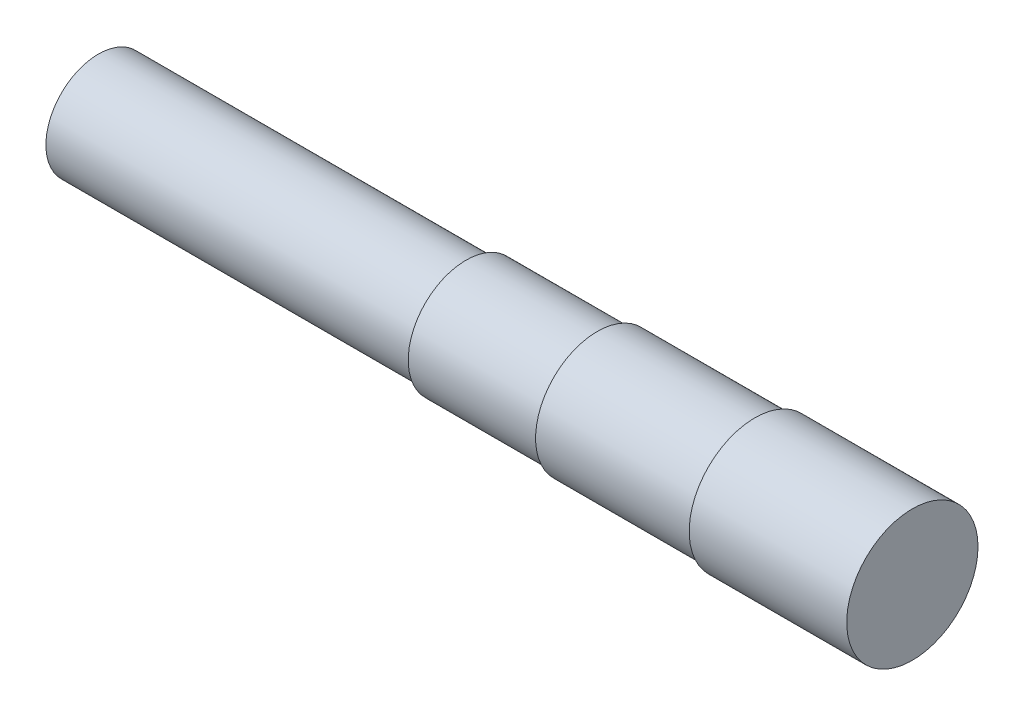
ISO-10303-21;
HEADER;
FILE_DESCRIPTION(('STEP AP214'),'2;1');
FILE_NAME('part.step','',(''),(''),'','','');
FILE_SCHEMA(('AUTOMOTIVE_DESIGN { 1 0 10303 214 1 1 1 1 }'));
ENDSEC;
DATA;
#1=APPLICATION_CONTEXT('core data for automotive mechanical design processes');
#2=APPLICATION_PROTOCOL_DEFINITION('international standard','automotive_design',2000,#1);
#3=PRODUCT_CONTEXT('',#1,'mechanical');
#4=PRODUCT('Part','Part','',(#3));
#5=PRODUCT_RELATED_PRODUCT_CATEGORY('part','',(#4));
#6=PRODUCT_DEFINITION_FORMATION('','',#4);
#7=PRODUCT_DEFINITION_CONTEXT('part definition',#1,'design');
#8=PRODUCT_DEFINITION('design','',#6,#7);
#9=PRODUCT_DEFINITION_SHAPE('','',#8);
#10=(LENGTH_UNIT() NAMED_UNIT(*) SI_UNIT(.MILLI.,.METRE.));
#11=(NAMED_UNIT(*) PLANE_ANGLE_UNIT() SI_UNIT($,.RADIAN.));
#12=(NAMED_UNIT(*) SI_UNIT($,.STERADIAN.) SOLID_ANGLE_UNIT());
#13=UNCERTAINTY_MEASURE_WITH_UNIT(LENGTH_MEASURE(1.E-05),#10,'distance_accuracy_value','');
#14=(GEOMETRIC_REPRESENTATION_CONTEXT(3) GLOBAL_UNCERTAINTY_ASSIGNED_CONTEXT((#13)) GLOBAL_UNIT_ASSIGNED_CONTEXT((#10,
#11,#12)) REPRESENTATION_CONTEXT('',''));
#15=CARTESIAN_POINT('',(0.,0.,0.));
#16=DIRECTION('',(0.,0.,1.));
#17=DIRECTION('',(1.,0.,0.));
#18=AXIS2_PLACEMENT_3D('',#15,#16,#17);
#19=CARTESIAN_POINT('',(0.,0.,0.));
#20=DIRECTION('',(1.,0.,0.));
#21=DIRECTION('',(0.,0.,-1.));
#22=AXIS2_PLACEMENT_3D('',#19,#20,#21);
#23=PLANE('',#22);
#24=CARTESIAN_POINT('',(0.,0.,0.));
#25=DIRECTION('',(1.,0.,0.));
#26=DIRECTION('',(0.,0.,-1.));
#27=AXIS2_PLACEMENT_3D('',#24,#25,#26);
#28=CIRCLE('',#27,12.5);
#29=CARTESIAN_POINT('',(0.,0.,-12.5));
#30=VERTEX_POINT('',#29);
#31=EDGE_CURVE('E78',#30,#30,#28,.T.);
#32=ORIENTED_EDGE('',*,*,#31,.F.);
#33=EDGE_LOOP('',(#32));
#34=FACE_BOUND('',#33,.T.);
#35=CARTESIAN_POINT('',(0.,0.,0.));
#36=DIRECTION('',(1.,0.,0.));
#37=DIRECTION('',(0.,0.,-1.));
#38=AXIS2_PLACEMENT_3D('',#35,#36,#37);
#39=CIRCLE('',#38,11.75);
#40=CARTESIAN_POINT('',(0.,0.,-11.75));
#41=VERTEX_POINT('',#40);
#42=EDGE_CURVE('E10',#41,#41,#39,.T.);
#43=ORIENTED_EDGE('',*,*,#42,.T.);
#44=EDGE_LOOP('',(#43));
#45=FACE_BOUND('',#44,.T.);
#46=ADVANCED_FACE('F43',(#34,#45),#23,.F.);
#47=CARTESIAN_POINT('',(0.,0.,0.));
#48=DIRECTION('',(1.,0.,0.));
#49=DIRECTION('',(0.,0.,-1.));
#50=AXIS2_PLACEMENT_3D('',#47,#48,#49);
#51=CYLINDRICAL_SURFACE('',#50,11.75);
#52=CARTESIAN_POINT('',(-30.,0.,0.));
#53=DIRECTION('',(1.,0.,0.));
#54=DIRECTION('',(0.,0.,-1.));
#55=AXIS2_PLACEMENT_3D('',#52,#53,#54);
#56=CIRCLE('',#55,11.75);
#57=CARTESIAN_POINT('',(-30.,0.,-11.75));
#58=VERTEX_POINT('',#57);
#59=EDGE_CURVE('E50',#58,#58,#56,.T.);
#60=ORIENTED_EDGE('',*,*,#59,.T.);
#61=EDGE_LOOP('',(#60));
#62=FACE_BOUND('',#61,.T.);
#63=ORIENTED_EDGE('',*,*,#42,.F.);
#64=EDGE_LOOP('',(#63));
#65=FACE_BOUND('',#64,.T.);
#66=ADVANCED_FACE('F86',(#62,#65),#51,.T.);
#67=CARTESIAN_POINT('',(-30.,-1.38777878078144E-13,0.));
#68=DIRECTION('',(1.,0.,0.));
#69=DIRECTION('',(0.,0.,-1.));
#70=AXIS2_PLACEMENT_3D('',#67,#68,#69);
#71=PLANE('',#70);
#72=ORIENTED_EDGE('',*,*,#59,.F.);
#73=EDGE_LOOP('',(#72));
#74=FACE_BOUND('',#73,.T.);
#75=CARTESIAN_POINT('',(-30.,0.,0.));
#76=DIRECTION('',(1.,0.,0.));
#77=DIRECTION('',(0.,0.,-1.));
#78=AXIS2_PLACEMENT_3D('',#75,#76,#77);
#79=CIRCLE('',#78,11.);
#80=CARTESIAN_POINT('',(-30.,0.,-11.));
#81=VERTEX_POINT('',#80);
#82=EDGE_CURVE('E55',#81,#81,#79,.T.);
#83=ORIENTED_EDGE('',*,*,#82,.T.);
#84=EDGE_LOOP('',(#83));
#85=FACE_BOUND('',#84,.T.);
#86=ADVANCED_FACE('F90',(#74,#85),#71,.F.);
#87=CARTESIAN_POINT('',(0.,0.,0.));
#88=DIRECTION('',(1.,0.,0.));
#89=DIRECTION('',(0.,0.,-1.));
#90=AXIS2_PLACEMENT_3D('',#87,#88,#89);
#91=CYLINDRICAL_SURFACE('',#90,11.);
#92=CARTESIAN_POINT('',(-55.,0.,0.));
#93=DIRECTION('',(1.,0.,0.));
#94=DIRECTION('',(0.,0.,-1.));
#95=AXIS2_PLACEMENT_3D('',#92,#93,#94);
#96=CIRCLE('',#95,11.);
#97=CARTESIAN_POINT('',(-55.,0.,-11.));
#98=VERTEX_POINT('',#97);
#99=EDGE_CURVE('E60',#98,#98,#96,.T.);
#100=ORIENTED_EDGE('',*,*,#99,.T.);
#101=EDGE_LOOP('',(#100));
#102=FACE_BOUND('',#101,.T.);
#103=ORIENTED_EDGE('',*,*,#82,.F.);
#104=EDGE_LOOP('',(#103));
#105=FACE_BOUND('',#104,.T.);
#106=ADVANCED_FACE('F94',(#102,#105),#91,.T.);
#107=CARTESIAN_POINT('',(-55.,0.,0.));
#108=DIRECTION('',(-1.,0.,0.));
#109=DIRECTION('',(0.,0.,1.));
#110=AXIS2_PLACEMENT_3D('',#107,#108,#109);
#111=PLANE('',#110);
#112=CARTESIAN_POINT('',(-55.,0.,0.));
#113=DIRECTION('',(1.,0.,0.));
#114=DIRECTION('',(0.,0.,-1.));
#115=AXIS2_PLACEMENT_3D('',#112,#113,#114);
#116=CIRCLE('',#115,9.99999999999999);
#117=CARTESIAN_POINT('',(-55.,0.,-9.99999999999999));
#118=VERTEX_POINT('',#117);
#119=EDGE_CURVE('E66',#118,#118,#116,.T.);
#120=ORIENTED_EDGE('',*,*,#119,.T.);
#121=EDGE_LOOP('',(#120));
#122=FACE_BOUND('',#121,.T.);
#123=ORIENTED_EDGE('',*,*,#99,.F.);
#124=EDGE_LOOP('',(#123));
#125=FACE_BOUND('',#124,.T.);
#126=ADVANCED_FACE('F101',(#122,#125),#111,.T.);
#127=CARTESIAN_POINT('',(0.,0.,0.));
#128=DIRECTION('',(1.,0.,0.));
#129=DIRECTION('',(0.,0.,-1.));
#130=AXIS2_PLACEMENT_3D('',#127,#128,#129);
#131=CYLINDRICAL_SURFACE('',#130,9.99999999999999);
#132=CARTESIAN_POINT('',(-125.,0.,0.));
#133=DIRECTION('',(1.,0.,0.));
#134=DIRECTION('',(0.,0.,-1.));
#135=AXIS2_PLACEMENT_3D('',#132,#133,#134);
#136=CIRCLE('',#135,9.99999999999998);
#137=CARTESIAN_POINT('',(-125.,0.,-9.99999999999998));
#138=VERTEX_POINT('',#137);
#139=EDGE_CURVE('E70',#138,#138,#136,.T.);
#140=ORIENTED_EDGE('',*,*,#139,.T.);
#141=EDGE_LOOP('',(#140));
#142=FACE_BOUND('',#141,.T.);
#143=ORIENTED_EDGE('',*,*,#119,.F.);
#144=EDGE_LOOP('',(#143));
#145=FACE_BOUND('',#144,.T.);
#146=ADVANCED_FACE('F105',(#142,#145),#131,.T.);
#147=CARTESIAN_POINT('',(-125.,0.,0.));
#148=DIRECTION('',(-1.,0.,0.));
#149=DIRECTION('',(0.,0.,1.));
#150=AXIS2_PLACEMENT_3D('',#147,#148,#149);
#151=PLANE('',#150);
#152=ORIENTED_EDGE('',*,*,#139,.F.);
#153=EDGE_LOOP('',(#152));
#154=FACE_BOUND('',#153,.T.);
#155=ADVANCED_FACE('F109',(#154),#151,.T.);
#156=CARTESIAN_POINT('',(30.,0.,0.));
#157=DIRECTION('',(1.,0.,0.));
#158=DIRECTION('',(0.,0.,-1.));
#159=AXIS2_PLACEMENT_3D('',#156,#157,#158);
#160=PLANE('',#159);
#161=CARTESIAN_POINT('',(30.,0.,0.));
#162=DIRECTION('',(1.,0.,0.));
#163=DIRECTION('',(0.,0.,-1.));
#164=AXIS2_PLACEMENT_3D('',#161,#162,#163);
#165=CIRCLE('',#164,12.5);
#166=CARTESIAN_POINT('',(30.,0.,-12.5));
#167=VERTEX_POINT('',#166);
#168=EDGE_CURVE('E74',#167,#167,#165,.T.);
#169=ORIENTED_EDGE('',*,*,#168,.T.);
#170=EDGE_LOOP('',(#169));
#171=FACE_BOUND('',#170,.T.);
#172=ADVANCED_FACE('F113',(#171),#160,.T.);
#173=CARTESIAN_POINT('',(0.,0.,0.));
#174=DIRECTION('',(1.,0.,0.));
#175=DIRECTION('',(0.,0.,-1.));
#176=AXIS2_PLACEMENT_3D('',#173,#174,#175);
#177=CYLINDRICAL_SURFACE('',#176,12.5);
#178=ORIENTED_EDGE('',*,*,#168,.F.);
#179=EDGE_LOOP('',(#178));
#180=FACE_BOUND('',#179,.T.);
#181=ORIENTED_EDGE('',*,*,#31,.T.);
#182=EDGE_LOOP('',(#181));
#183=FACE_BOUND('',#182,.T.);
#184=ADVANCED_FACE('F83',(#180,#183),#177,.T.);
#185=CLOSED_SHELL('',(#46,#66,#86,#106,#126,#146,#155,#172,#184));
#186=MANIFOLD_SOLID_BREP('B2',#185);
#187=ADVANCED_BREP_SHAPE_REPRESENTATION('',(#18,#186),#14);
#188=SHAPE_DEFINITION_REPRESENTATION(#9,#187);
ENDSEC;
END-ISO-10303-21;
